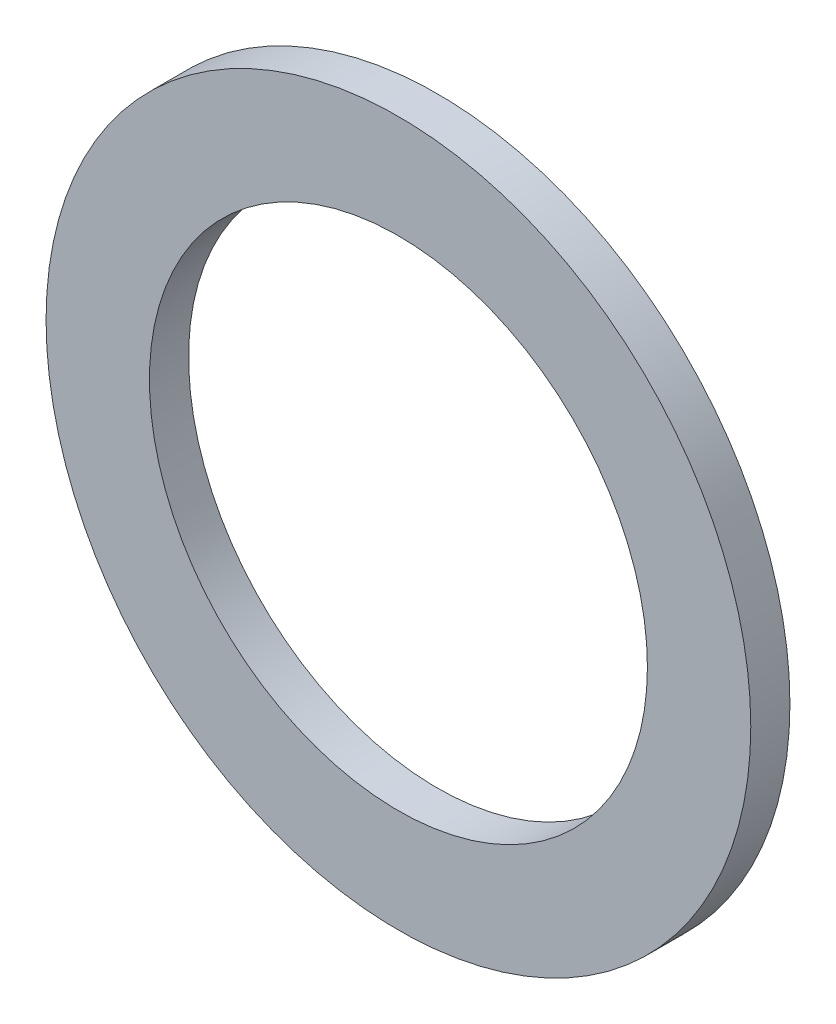
ISO-10303-21;
HEADER;
FILE_DESCRIPTION(('STEP AP214'),'2;1');
FILE_NAME('part.step','',(''),(''),'','','');
FILE_SCHEMA(('AUTOMOTIVE_DESIGN { 1 0 10303 214 1 1 1 1 }'));
ENDSEC;
DATA;
#1=APPLICATION_CONTEXT('core data for automotive mechanical design processes');
#2=APPLICATION_PROTOCOL_DEFINITION('international standard','automotive_design',2000,#1);
#3=PRODUCT_CONTEXT('',#1,'mechanical');
#4=PRODUCT('Part','Part','',(#3));
#5=PRODUCT_RELATED_PRODUCT_CATEGORY('part','',(#4));
#6=PRODUCT_DEFINITION_FORMATION('','',#4);
#7=PRODUCT_DEFINITION_CONTEXT('part definition',#1,'design');
#8=PRODUCT_DEFINITION('design','',#6,#7);
#9=PRODUCT_DEFINITION_SHAPE('','',#8);
#10=(LENGTH_UNIT() NAMED_UNIT(*) SI_UNIT(.MILLI.,.METRE.));
#11=(NAMED_UNIT(*) PLANE_ANGLE_UNIT() SI_UNIT($,.RADIAN.));
#12=(NAMED_UNIT(*) SI_UNIT($,.STERADIAN.) SOLID_ANGLE_UNIT());
#13=UNCERTAINTY_MEASURE_WITH_UNIT(LENGTH_MEASURE(1.E-05),#10,'distance_accuracy_value','');
#14=(GEOMETRIC_REPRESENTATION_CONTEXT(3) GLOBAL_UNCERTAINTY_ASSIGNED_CONTEXT((#13)) GLOBAL_UNIT_ASSIGNED_CONTEXT((#10,
#11,#12)) REPRESENTATION_CONTEXT('',''));
#15=CARTESIAN_POINT('',(0.,0.,0.));
#16=DIRECTION('',(0.,0.,1.));
#17=DIRECTION('',(1.,0.,0.));
#18=AXIS2_PLACEMENT_3D('',#15,#16,#17);
#19=CARTESIAN_POINT('',(0.,0.,0.5));
#20=DIRECTION('',(0.,0.,1.));
#21=DIRECTION('',(1.,0.,0.));
#22=AXIS2_PLACEMENT_3D('',#19,#20,#21);
#23=PLANE('',#22);
#24=CARTESIAN_POINT('',(0.,0.,0.5));
#25=DIRECTION('',(0.,0.,1.));
#26=DIRECTION('',(1.,0.,0.));
#27=AXIS2_PLACEMENT_3D('',#24,#25,#26);
#28=CIRCLE('',#27,4.5);
#29=CARTESIAN_POINT('',(4.5,0.,0.5));
#30=VERTEX_POINT('',#29);
#31=EDGE_CURVE('E10',#30,#30,#28,.T.);
#32=ORIENTED_EDGE('',*,*,#31,.T.);
#33=EDGE_LOOP('',(#32));
#34=FACE_BOUND('',#33,.T.);
#35=CARTESIAN_POINT('',(0.,0.,0.5));
#36=DIRECTION('',(0.,0.,1.));
#37=DIRECTION('',(1.,0.,0.));
#38=AXIS2_PLACEMENT_3D('',#35,#36,#37);
#39=CIRCLE('',#38,3.18);
#40=CARTESIAN_POINT('',(3.18,0.,0.5));
#41=VERTEX_POINT('',#40);
#42=EDGE_CURVE('E50',#41,#41,#39,.T.);
#43=ORIENTED_EDGE('',*,*,#42,.F.);
#44=EDGE_LOOP('',(#43));
#45=FACE_BOUND('',#44,.T.);
#46=ADVANCED_FACE('F37',(#34,#45),#23,.T.);
#47=CARTESIAN_POINT('',(0.,0.,0.));
#48=DIRECTION('',(0.,0.,1.));
#49=DIRECTION('',(1.,0.,0.));
#50=AXIS2_PLACEMENT_3D('',#47,#48,#49);
#51=PLANE('',#50);
#52=CARTESIAN_POINT('',(0.,0.,0.));
#53=DIRECTION('',(0.,0.,1.));
#54=DIRECTION('',(1.,0.,0.));
#55=AXIS2_PLACEMENT_3D('',#52,#53,#54);
#56=CIRCLE('',#55,4.5);
#57=CARTESIAN_POINT('',(4.5,0.,0.));
#58=VERTEX_POINT('',#57);
#59=EDGE_CURVE('E41',#58,#58,#56,.T.);
#60=ORIENTED_EDGE('',*,*,#59,.F.);
#61=EDGE_LOOP('',(#60));
#62=FACE_BOUND('',#61,.T.);
#63=CARTESIAN_POINT('',(0.,0.,0.));
#64=DIRECTION('',(0.,0.,1.));
#65=DIRECTION('',(1.,0.,0.));
#66=AXIS2_PLACEMENT_3D('',#63,#64,#65);
#67=CIRCLE('',#66,3.18);
#68=CARTESIAN_POINT('',(3.18,0.,0.));
#69=VERTEX_POINT('',#68);
#70=EDGE_CURVE('E52',#69,#69,#67,.T.);
#71=ORIENTED_EDGE('',*,*,#70,.T.);
#72=EDGE_LOOP('',(#71));
#73=FACE_BOUND('',#72,.T.);
#74=ADVANCED_FACE('F64',(#62,#73),#51,.F.);
#75=CARTESIAN_POINT('',(0.,0.,0.5));
#76=DIRECTION('',(0.,0.,-1.));
#77=DIRECTION('',(-1.,0.,0.));
#78=AXIS2_PLACEMENT_3D('',#75,#76,#77);
#79=CYLINDRICAL_SURFACE('',#78,4.5);
#80=ORIENTED_EDGE('',*,*,#31,.F.);
#81=EDGE_LOOP('',(#80));
#82=FACE_BOUND('',#81,.T.);
#83=ORIENTED_EDGE('',*,*,#59,.T.);
#84=EDGE_LOOP('',(#83));
#85=FACE_BOUND('',#84,.T.);
#86=ADVANCED_FACE('F39',(#82,#85),#79,.T.);
#87=CARTESIAN_POINT('',(0.,0.,0.5));
#88=DIRECTION('',(0.,0.,-1.));
#89=DIRECTION('',(-1.,0.,0.));
#90=AXIS2_PLACEMENT_3D('',#87,#88,#89);
#91=CYLINDRICAL_SURFACE('',#90,3.18);
#92=ORIENTED_EDGE('',*,*,#42,.T.);
#93=EDGE_LOOP('',(#92));
#94=FACE_BOUND('',#93,.T.);
#95=ORIENTED_EDGE('',*,*,#70,.F.);
#96=EDGE_LOOP('',(#95));
#97=FACE_BOUND('',#96,.T.);
#98=ADVANCED_FACE('F60',(#94,#97),#91,.F.);
#99=CLOSED_SHELL('',(#46,#74,#86,#98));
#100=MANIFOLD_SOLID_BREP('B2',#99);
#101=ADVANCED_BREP_SHAPE_REPRESENTATION('',(#18,#100),#14);
#102=SHAPE_DEFINITION_REPRESENTATION(#9,#101);
ENDSEC;
END-ISO-10303-21;
